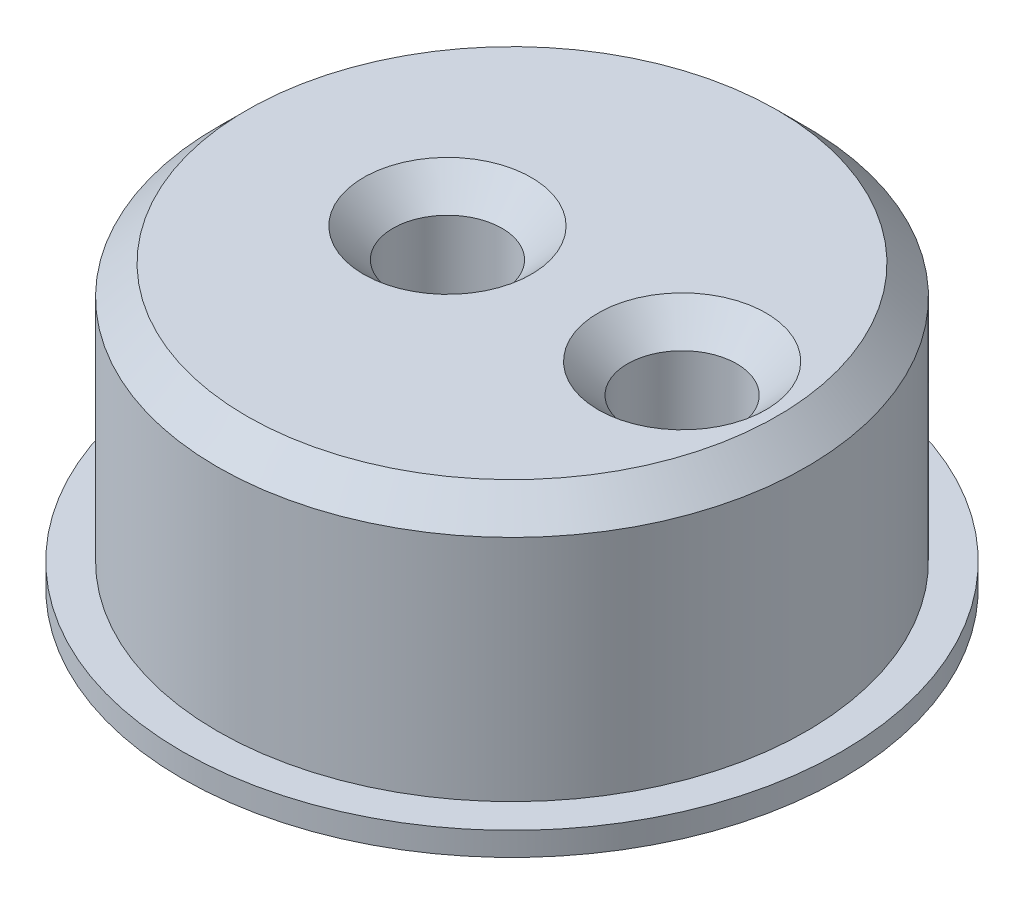
ISO-10303-21;
HEADER;
FILE_DESCRIPTION(('STEP AP214'),'2;1');
FILE_NAME('part.step','',(''),(''),'','','');
FILE_SCHEMA(('AUTOMOTIVE_DESIGN { 1 0 10303 214 1 1 1 1 }'));
ENDSEC;
DATA;
#1=APPLICATION_CONTEXT('core data for automotive mechanical design processes');
#2=APPLICATION_PROTOCOL_DEFINITION('international standard','automotive_design',2000,#1);
#3=PRODUCT_CONTEXT('',#1,'mechanical');
#4=PRODUCT('Part','Part','',(#3));
#5=PRODUCT_RELATED_PRODUCT_CATEGORY('part','',(#4));
#6=PRODUCT_DEFINITION_FORMATION('','',#4);
#7=PRODUCT_DEFINITION_CONTEXT('part definition',#1,'design');
#8=PRODUCT_DEFINITION('design','',#6,#7);
#9=PRODUCT_DEFINITION_SHAPE('','',#8);
#10=(LENGTH_UNIT() NAMED_UNIT(*) SI_UNIT(.MILLI.,.METRE.));
#11=(NAMED_UNIT(*) PLANE_ANGLE_UNIT() SI_UNIT($,.RADIAN.));
#12=(NAMED_UNIT(*) SI_UNIT($,.STERADIAN.) SOLID_ANGLE_UNIT());
#13=UNCERTAINTY_MEASURE_WITH_UNIT(LENGTH_MEASURE(1.E-05),#10,'distance_accuracy_value','');
#14=(GEOMETRIC_REPRESENTATION_CONTEXT(3) GLOBAL_UNCERTAINTY_ASSIGNED_CONTEXT((#13)) GLOBAL_UNIT_ASSIGNED_CONTEXT((#10,
#11,#12)) REPRESENTATION_CONTEXT('',''));
#15=CARTESIAN_POINT('',(0.,0.,0.));
#16=DIRECTION('',(0.,0.,1.));
#17=DIRECTION('',(1.,0.,0.));
#18=AXIS2_PLACEMENT_3D('',#15,#16,#17);
#19=CARTESIAN_POINT('',(0.,4.4,0.));
#20=DIRECTION('',(0.,1.,0.));
#21=DIRECTION('',(0.,0.,1.));
#22=AXIS2_PLACEMENT_3D('',#19,#20,#21);
#23=PLANE('',#22);
#24=CARTESIAN_POINT('',(-1.1,4.4,0.));
#25=DIRECTION('',(0.,1.,0.));
#26=DIRECTION('',(0.,0.,1.));
#27=AXIS2_PLACEMENT_3D('',#24,#25,#26);
#28=CIRCLE('',#27,1.43000000000001);
#29=CARTESIAN_POINT('',(-1.1,4.4,1.43000000000001));
#30=VERTEX_POINT('',#29);
#31=EDGE_CURVE('E48',#30,#30,#28,.F.);
#32=ORIENTED_EDGE('',*,*,#31,.T.);
#33=EDGE_LOOP('',(#32));
#34=FACE_BOUND('',#33,.T.);
#35=CARTESIAN_POINT('',(0.,4.4,0.));
#36=DIRECTION('',(0.,1.,0.));
#37=DIRECTION('',(0.,0.,1.));
#38=AXIS2_PLACEMENT_3D('',#35,#36,#37);
#39=CIRCLE('',#38,4.52);
#40=CARTESIAN_POINT('',(0.,4.4,4.52));
#41=VERTEX_POINT('',#40);
#42=EDGE_CURVE('E54',#41,#41,#39,.T.);
#43=ORIENTED_EDGE('',*,*,#42,.T.);
#44=EDGE_LOOP('',(#43));
#45=FACE_BOUND('',#44,.T.);
#46=CARTESIAN_POINT('',(2.9,4.4,0.));
#47=DIRECTION('',(0.,1.,0.));
#48=DIRECTION('',(0.,0.,1.));
#49=AXIS2_PLACEMENT_3D('',#46,#47,#48);
#50=CIRCLE('',#49,1.43);
#51=CARTESIAN_POINT('',(2.9,4.4,1.43));
#52=VERTEX_POINT('',#51);
#53=EDGE_CURVE('E60',#52,#52,#50,.F.);
#54=ORIENTED_EDGE('',*,*,#53,.T.);
#55=EDGE_LOOP('',(#54));
#56=FACE_BOUND('',#55,.T.);
#57=ADVANCED_FACE('F39',(#34,#45,#56),#23,.T.);
#58=CARTESIAN_POINT('',(0.,4.4,0.));
#59=DIRECTION('',(0.,-1.,0.));
#60=DIRECTION('',(0.,0.,-1.));
#61=AXIS2_PLACEMENT_3D('',#58,#59,#60);
#62=CYLINDRICAL_SURFACE('',#61,5.02);
#63=CARTESIAN_POINT('',(0.,3.9,0.));
#64=DIRECTION('',(0.,1.,0.));
#65=DIRECTION('',(0.,0.,1.));
#66=AXIS2_PLACEMENT_3D('',#63,#64,#65);
#67=CIRCLE('',#66,5.02);
#68=CARTESIAN_POINT('',(0.,3.9,5.02));
#69=VERTEX_POINT('',#68);
#70=EDGE_CURVE('E10',#69,#69,#67,.F.);
#71=ORIENTED_EDGE('',*,*,#70,.T.);
#72=EDGE_LOOP('',(#71));
#73=FACE_BOUND('',#72,.T.);
#74=CARTESIAN_POINT('',(0.,0.,0.));
#75=DIRECTION('',(0.,1.,0.));
#76=DIRECTION('',(0.,0.,1.));
#77=AXIS2_PLACEMENT_3D('',#74,#75,#76);
#78=CIRCLE('',#77,5.02);
#79=CARTESIAN_POINT('',(0.,0.,5.02));
#80=VERTEX_POINT('',#79);
#81=EDGE_CURVE('E88',#80,#80,#78,.T.);
#82=ORIENTED_EDGE('',*,*,#81,.T.);
#83=EDGE_LOOP('',(#82));
#84=FACE_BOUND('',#83,.T.);
#85=ADVANCED_FACE('F122',(#73,#84),#62,.T.);
#86=CARTESIAN_POINT('',(2.9,4.4,0.));
#87=DIRECTION('',(0.,-1.,0.));
#88=DIRECTION('',(0.,0.,-1.));
#89=AXIS2_PLACEMENT_3D('',#86,#87,#88);
#90=CYLINDRICAL_SURFACE('',#89,0.930000000000001);
#91=CARTESIAN_POINT('',(2.9,0.100000000000003,0.));
#92=DIRECTION('',(0.,-1.,0.));
#93=DIRECTION('',(0.,0.,-1.));
#94=AXIS2_PLACEMENT_3D('',#91,#92,#93);
#95=CIRCLE('',#94,0.930000000000001);
#96=CARTESIAN_POINT('',(2.9,0.100000000000003,-0.930000000000001));
#97=VERTEX_POINT('',#96);
#98=EDGE_CURVE('E80',#97,#97,#95,.T.);
#99=ORIENTED_EDGE('',*,*,#98,.T.);
#100=EDGE_LOOP('',(#99));
#101=FACE_BOUND('',#100,.T.);
#102=CARTESIAN_POINT('',(2.9,3.9,0.));
#103=DIRECTION('',(0.,1.,0.));
#104=DIRECTION('',(0.,0.,1.));
#105=AXIS2_PLACEMENT_3D('',#102,#103,#104);
#106=CIRCLE('',#105,0.930000000000001);
#107=CARTESIAN_POINT('',(2.9,3.9,0.930000000000001));
#108=VERTEX_POINT('',#107);
#109=EDGE_CURVE('E84',#108,#108,#106,.T.);
#110=ORIENTED_EDGE('',*,*,#109,.T.);
#111=EDGE_LOOP('',(#110));
#112=FACE_BOUND('',#111,.T.);
#113=ADVANCED_FACE('F127',(#101,#112),#90,.F.);
#114=CARTESIAN_POINT('',(-1.1,4.4,0.));
#115=DIRECTION('',(0.,-1.,0.));
#116=DIRECTION('',(0.,0.,-1.));
#117=AXIS2_PLACEMENT_3D('',#114,#115,#116);
#118=CYLINDRICAL_SURFACE('',#117,0.93);
#119=CARTESIAN_POINT('',(-1.1,0.100000000000002,0.));
#120=DIRECTION('',(0.,-1.,0.));
#121=DIRECTION('',(0.,0.,-1.));
#122=AXIS2_PLACEMENT_3D('',#119,#120,#121);
#123=CIRCLE('',#122,0.93);
#124=CARTESIAN_POINT('',(-1.1,0.100000000000002,-0.93));
#125=VERTEX_POINT('',#124);
#126=EDGE_CURVE('E66',#125,#125,#123,.T.);
#127=ORIENTED_EDGE('',*,*,#126,.T.);
#128=EDGE_LOOP('',(#127));
#129=FACE_BOUND('',#128,.T.);
#130=CARTESIAN_POINT('',(-1.1,3.9,0.));
#131=DIRECTION('',(0.,1.,0.));
#132=DIRECTION('',(0.,0.,1.));
#133=AXIS2_PLACEMENT_3D('',#130,#131,#132);
#134=CIRCLE('',#133,0.93);
#135=CARTESIAN_POINT('',(-1.1,3.9,0.930000000000001));
#136=VERTEX_POINT('',#135);
#137=EDGE_CURVE('E69',#136,#136,#134,.T.);
#138=ORIENTED_EDGE('',*,*,#137,.T.);
#139=EDGE_LOOP('',(#138));
#140=FACE_BOUND('',#139,.T.);
#141=ADVANCED_FACE('F117',(#129,#140),#118,.F.);
#142=CARTESIAN_POINT('',(0.,-0.4,0.));
#143=DIRECTION('',(0.,-1.,0.));
#144=DIRECTION('',(0.,0.,-1.));
#145=AXIS2_PLACEMENT_3D('',#142,#143,#144);
#146=PLANE('',#145);
#147=CARTESIAN_POINT('',(2.9,-0.4,0.));
#148=DIRECTION('',(0.,-1.,0.));
#149=DIRECTION('',(0.,0.,-1.));
#150=AXIS2_PLACEMENT_3D('',#147,#148,#149);
#151=CIRCLE('',#150,1.43000000000001);
#152=CARTESIAN_POINT('',(2.9,-0.4,-1.43000000000001));
#153=VERTEX_POINT('',#152);
#154=EDGE_CURVE('E72',#153,#153,#151,.F.);
#155=ORIENTED_EDGE('',*,*,#154,.T.);
#156=EDGE_LOOP('',(#155));
#157=FACE_BOUND('',#156,.T.);
#158=CARTESIAN_POINT('',(-1.1,-0.4,0.));
#159=DIRECTION('',(0.,-1.,0.));
#160=DIRECTION('',(0.,0.,-1.));
#161=AXIS2_PLACEMENT_3D('',#158,#159,#160);
#162=CIRCLE('',#161,1.43);
#163=CARTESIAN_POINT('',(-1.1,-0.4,-1.43));
#164=VERTEX_POINT('',#163);
#165=EDGE_CURVE('E76',#164,#164,#162,.F.);
#166=ORIENTED_EDGE('',*,*,#165,.T.);
#167=EDGE_LOOP('',(#166));
#168=FACE_BOUND('',#167,.T.);
#169=CARTESIAN_POINT('',(0.,-0.4,0.));
#170=DIRECTION('',(0.,-1.,0.));
#171=DIRECTION('',(0.,0.,-1.));
#172=AXIS2_PLACEMENT_3D('',#169,#170,#171);
#173=CIRCLE('',#172,5.62);
#174=CARTESIAN_POINT('',(0.,-0.4,-5.62));
#175=VERTEX_POINT('',#174);
#176=EDGE_CURVE('E92',#175,#175,#173,.T.);
#177=ORIENTED_EDGE('',*,*,#176,.T.);
#178=EDGE_LOOP('',(#177));
#179=FACE_BOUND('',#178,.T.);
#180=ADVANCED_FACE('F101',(#157,#168,#179),#146,.T.);
#181=CARTESIAN_POINT('',(0.,0.,0.));
#182=DIRECTION('',(0.,-1.,0.));
#183=DIRECTION('',(0.,0.,-1.));
#184=AXIS2_PLACEMENT_3D('',#181,#182,#183);
#185=PLANE('',#184);
#186=ORIENTED_EDGE('',*,*,#81,.F.);
#187=EDGE_LOOP('',(#186));
#188=FACE_BOUND('',#187,.T.);
#189=CARTESIAN_POINT('',(0.,0.,0.));
#190=DIRECTION('',(0.,-1.,0.));
#191=DIRECTION('',(0.,0.,-1.));
#192=AXIS2_PLACEMENT_3D('',#189,#190,#191);
#193=CIRCLE('',#192,5.62);
#194=CARTESIAN_POINT('',(0.,0.,-5.62));
#195=VERTEX_POINT('',#194);
#196=EDGE_CURVE('E93',#195,#195,#193,.T.);
#197=ORIENTED_EDGE('',*,*,#196,.F.);
#198=EDGE_LOOP('',(#197));
#199=FACE_BOUND('',#198,.T.);
#200=ADVANCED_FACE('F107',(#188,#199),#185,.F.);
#201=CARTESIAN_POINT('',(0.,-0.4,0.));
#202=DIRECTION('',(0.,1.,0.));
#203=DIRECTION('',(0.,0.,1.));
#204=AXIS2_PLACEMENT_3D('',#201,#202,#203);
#205=CYLINDRICAL_SURFACE('',#204,5.62);
#206=ORIENTED_EDGE('',*,*,#176,.F.);
#207=EDGE_LOOP('',(#206));
#208=FACE_BOUND('',#207,.T.);
#209=ORIENTED_EDGE('',*,*,#196,.T.);
#210=EDGE_LOOP('',(#209));
#211=FACE_BOUND('',#210,.T.);
#212=ADVANCED_FACE('F103',(#208,#211),#205,.T.);
#213=CARTESIAN_POINT('',(2.9,0.100000000000003,0.));
#214=DIRECTION('',(0.,-1.,0.));
#215=DIRECTION('',(0.,0.,-1.));
#216=AXIS2_PLACEMENT_3D('',#213,#214,#215);
#217=CONICAL_SURFACE('',#216,0.930000000000001,0.78539816339745);
#218=ORIENTED_EDGE('',*,*,#154,.F.);
#219=EDGE_LOOP('',(#218));
#220=FACE_BOUND('',#219,.T.);
#221=ORIENTED_EDGE('',*,*,#98,.F.);
#222=EDGE_LOOP('',(#221));
#223=FACE_BOUND('',#222,.T.);
#224=ADVANCED_FACE('F106',(#220,#223),#217,.F.);
#225=CARTESIAN_POINT('',(-1.1,0.100000000000002,0.));
#226=DIRECTION('',(0.,-1.,0.));
#227=DIRECTION('',(0.,0.,-1.));
#228=AXIS2_PLACEMENT_3D('',#225,#226,#227);
#229=CONICAL_SURFACE('',#228,0.93,0.785398163397448);
#230=ORIENTED_EDGE('',*,*,#165,.F.);
#231=EDGE_LOOP('',(#230));
#232=FACE_BOUND('',#231,.T.);
#233=ORIENTED_EDGE('',*,*,#126,.F.);
#234=EDGE_LOOP('',(#233));
#235=FACE_BOUND('',#234,.T.);
#236=ADVANCED_FACE('F139',(#232,#235),#229,.F.);
#237=CARTESIAN_POINT('',(-1.1,3.9,0.));
#238=DIRECTION('',(0.,1.,0.));
#239=DIRECTION('',(0.,0.,1.));
#240=AXIS2_PLACEMENT_3D('',#237,#238,#239);
#241=CONICAL_SURFACE('',#240,0.93,0.78539816339745);
#242=ORIENTED_EDGE('',*,*,#31,.F.);
#243=EDGE_LOOP('',(#242));
#244=FACE_BOUND('',#243,.T.);
#245=ORIENTED_EDGE('',*,*,#137,.F.);
#246=EDGE_LOOP('',(#245));
#247=FACE_BOUND('',#246,.T.);
#248=ADVANCED_FACE('F146',(#244,#247),#241,.F.);
#249=CARTESIAN_POINT('',(0.,4.4,0.));
#250=DIRECTION('',(0.,-1.,0.));
#251=DIRECTION('',(0.,0.,-1.));
#252=AXIS2_PLACEMENT_3D('',#249,#250,#251);
#253=CONICAL_SURFACE('',#252,4.52,0.785398163397448);
#254=ORIENTED_EDGE('',*,*,#70,.F.);
#255=EDGE_LOOP('',(#254));
#256=FACE_BOUND('',#255,.T.);
#257=ORIENTED_EDGE('',*,*,#42,.F.);
#258=EDGE_LOOP('',(#257));
#259=FACE_BOUND('',#258,.T.);
#260=ADVANCED_FACE('F152',(#256,#259),#253,.T.);
#261=CARTESIAN_POINT('',(2.9,3.9,0.));
#262=DIRECTION('',(0.,1.,0.));
#263=DIRECTION('',(0.,0.,1.));
#264=AXIS2_PLACEMENT_3D('',#261,#262,#263);
#265=CONICAL_SURFACE('',#264,0.930000000000001,0.785398163397448);
#266=ORIENTED_EDGE('',*,*,#53,.F.);
#267=EDGE_LOOP('',(#266));
#268=FACE_BOUND('',#267,.T.);
#269=ORIENTED_EDGE('',*,*,#109,.F.);
#270=EDGE_LOOP('',(#269));
#271=FACE_BOUND('',#270,.T.);
#272=ADVANCED_FACE('F42',(#268,#271),#265,.F.);
#273=CLOSED_SHELL('',(#57,#85,#113,#141,#180,#200,#212,#224,#236,#248,#260,#272));
#274=MANIFOLD_SOLID_BREP('B2',#273);
#275=ADVANCED_BREP_SHAPE_REPRESENTATION('',(#18,#274),#14);
#276=SHAPE_DEFINITION_REPRESENTATION(#9,#275);
ENDSEC;
END-ISO-10303-21;
